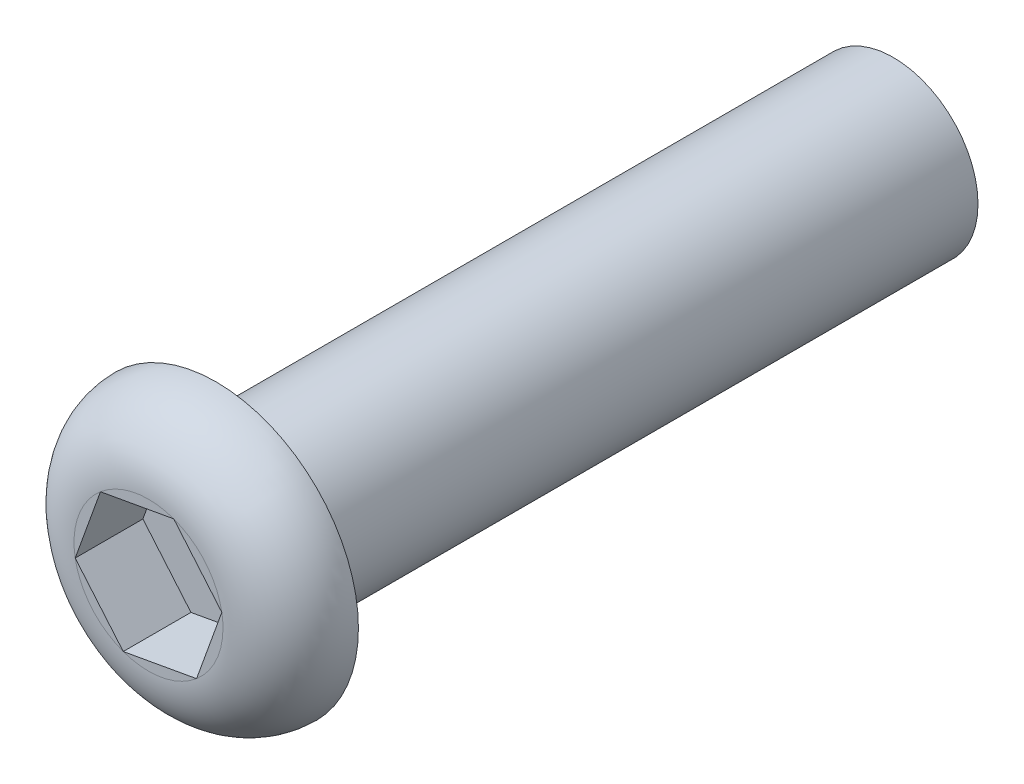
ISO-10303-21;
HEADER;
FILE_DESCRIPTION(('STEP AP214'),'2;1');
FILE_NAME('part.step','',(''),(''),'','','');
FILE_SCHEMA(('AUTOMOTIVE_DESIGN { 1 0 10303 214 1 1 1 1 }'));
ENDSEC;
DATA;
#1=APPLICATION_CONTEXT('core data for automotive mechanical design processes');
#2=APPLICATION_PROTOCOL_DEFINITION('international standard','automotive_design',2000,#1);
#3=PRODUCT_CONTEXT('',#1,'mechanical');
#4=PRODUCT('Part','Part','',(#3));
#5=PRODUCT_RELATED_PRODUCT_CATEGORY('part','',(#4));
#6=PRODUCT_DEFINITION_FORMATION('','',#4);
#7=PRODUCT_DEFINITION_CONTEXT('part definition',#1,'design');
#8=PRODUCT_DEFINITION('design','',#6,#7);
#9=PRODUCT_DEFINITION_SHAPE('','',#8);
#10=(LENGTH_UNIT() NAMED_UNIT(*) SI_UNIT(.MILLI.,.METRE.));
#11=(NAMED_UNIT(*) PLANE_ANGLE_UNIT() SI_UNIT($,.RADIAN.));
#12=(NAMED_UNIT(*) SI_UNIT($,.STERADIAN.) SOLID_ANGLE_UNIT());
#13=UNCERTAINTY_MEASURE_WITH_UNIT(LENGTH_MEASURE(1.E-05),#10,'distance_accuracy_value','');
#14=(GEOMETRIC_REPRESENTATION_CONTEXT(3) GLOBAL_UNCERTAINTY_ASSIGNED_CONTEXT((#13)) GLOBAL_UNIT_ASSIGNED_CONTEXT((#10,
#11,#12)) REPRESENTATION_CONTEXT('',''));
#15=CARTESIAN_POINT('',(0.,0.,0.));
#16=DIRECTION('',(0.,0.,1.));
#17=DIRECTION('',(1.,0.,0.));
#18=AXIS2_PLACEMENT_3D('',#15,#16,#17);
#19=CARTESIAN_POINT('',(0.,0.,27.94));
#20=DIRECTION('',(0.,0.,1.));
#21=DIRECTION('',(1.,0.,0.));
#22=AXIS2_PLACEMENT_3D('',#19,#20,#21);
#23=PLANE('',#22);
#24=DIRECTION('',(0.984262721187388,0.176711334330307,0.));
#25=VECTOR('',#24,1.);
#26=CARTESIAN_POINT('',(-0.947431027460046,-2.62846161246574,27.94));
#27=LINE('',#26,#25);
#28=CARTESIAN_POINT('',(-0.947431027460046,-2.62846161246574,27.94));
#29=VERTEX_POINT('',#28);
#30=CARTESIAN_POINT('',(1.80259901553751,-2.13473014434687,27.94));
#31=VERTEX_POINT('',#30);
#32=EDGE_CURVE('E59',#29,#31,#27,.T.);
#33=ORIENTED_EDGE('',*,*,#32,.F.);
#34=CARTESIAN_POINT('',(0.,0.,27.94));
#35=DIRECTION('',(0.,0.,1.));
#36=DIRECTION('',(1.,0.,0.));
#37=AXIS2_PLACEMENT_3D('',#34,#35,#36);
#38=CIRCLE('',#37,2.794);
#39=EDGE_CURVE('E215',#29,#31,#38,.T.);
#40=ORIENTED_EDGE('',*,*,#39,.T.);
#41=EDGE_LOOP('',(#33,#40));
#42=FACE_BOUND('',#41,.T.);
#43=ADVANCED_FACE('F43',(#42),#23,.T.);
#44=DIRECTION('',(0.645167865260385,-0.764040853381125,0.));
#45=VECTOR('',#44,1.);
#46=CARTESIAN_POINT('',(-2.75003004299756,-0.493731468118877,27.94));
#47=LINE('',#46,#45);
#48=CARTESIAN_POINT('',(-2.75003004299756,-0.493731468118877,27.94));
#49=VERTEX_POINT('',#48);
#50=EDGE_CURVE('E142',#49,#29,#47,.T.);
#51=ORIENTED_EDGE('',*,*,#50,.F.);
#52=EDGE_CURVE('E216',#49,#29,#38,.T.);
#53=ORIENTED_EDGE('',*,*,#52,.T.);
#54=EDGE_LOOP('',(#51,#53));
#55=FACE_BOUND('',#54,.T.);
#56=ADVANCED_FACE('F178',(#55),#23,.T.);
#57=DIRECTION('',(-0.339094855927003,-0.940752187711432,0.));
#58=VECTOR('',#57,1.);
#59=CARTESIAN_POINT('',(-1.80259901553751,2.13473014434686,27.94));
#60=LINE('',#59,#58);
#61=CARTESIAN_POINT('',(-1.80259901553751,2.13473014434686,27.94));
#62=VERTEX_POINT('',#61);
#63=EDGE_CURVE('E140',#62,#49,#60,.T.);
#64=ORIENTED_EDGE('',*,*,#63,.F.);
#65=EDGE_CURVE('E218',#62,#49,#38,.T.);
#66=ORIENTED_EDGE('',*,*,#65,.T.);
#67=EDGE_LOOP('',(#64,#66));
#68=FACE_BOUND('',#67,.T.);
#69=ADVANCED_FACE('F183',(#68),#23,.T.);
#70=DIRECTION('',(-0.984262721187388,-0.176711334330307,0.));
#71=VECTOR('',#70,1.);
#72=CARTESIAN_POINT('',(0.947431027460046,2.62846161246574,27.94));
#73=LINE('',#72,#71);
#74=CARTESIAN_POINT('',(0.947431027460046,2.62846161246574,27.94));
#75=VERTEX_POINT('',#74);
#76=EDGE_CURVE('E107',#75,#62,#73,.T.);
#77=ORIENTED_EDGE('',*,*,#76,.F.);
#78=EDGE_CURVE('E51',#75,#62,#38,.T.);
#79=ORIENTED_EDGE('',*,*,#78,.T.);
#80=EDGE_LOOP('',(#77,#79));
#81=FACE_BOUND('',#80,.T.);
#82=ADVANCED_FACE('F202',(#81),#23,.T.);
#83=DIRECTION('',(-0.645167865260385,0.764040853381125,0.));
#84=VECTOR('',#83,1.);
#85=CARTESIAN_POINT('',(2.75003004299756,0.493731468118877,27.94));
#86=LINE('',#85,#84);
#87=CARTESIAN_POINT('',(2.75003004299756,0.493731468118877,27.94));
#88=VERTEX_POINT('',#87);
#89=EDGE_CURVE('E136',#88,#75,#86,.T.);
#90=ORIENTED_EDGE('',*,*,#89,.F.);
#91=EDGE_CURVE('E11',#88,#75,#38,.T.);
#92=ORIENTED_EDGE('',*,*,#91,.T.);
#93=EDGE_LOOP('',(#90,#92));
#94=FACE_BOUND('',#93,.T.);
#95=ADVANCED_FACE('F174',(#94),#23,.T.);
#96=CARTESIAN_POINT('',(0.,0.,25.4));
#97=DIRECTION('',(0.,0.,1.));
#98=DIRECTION('',(1.,0.,0.));
#99=AXIS2_PLACEMENT_3D('',#96,#97,#98);
#100=TOROIDAL_SURFACE('',#99,2.794,2.54);
#101=ORIENTED_EDGE('',*,*,#91,.F.);
#102=EDGE_CURVE('E52',#31,#88,#38,.T.);
#103=ORIENTED_EDGE('',*,*,#102,.F.);
#104=ORIENTED_EDGE('',*,*,#39,.F.);
#105=ORIENTED_EDGE('',*,*,#52,.F.);
#106=ORIENTED_EDGE('',*,*,#65,.F.);
#107=ORIENTED_EDGE('',*,*,#78,.F.);
#108=EDGE_LOOP('',(#101,#103,#104,#105,#106,#107));
#109=FACE_BOUND('',#108,.T.);
#110=CARTESIAN_POINT('',(0.,0.,25.4));
#111=DIRECTION('',(0.,0.,1.));
#112=DIRECTION('',(1.,0.,0.));
#113=AXIS2_PLACEMENT_3D('',#110,#111,#112);
#114=CIRCLE('',#113,5.334);
#115=CARTESIAN_POINT('',(5.334,0.,25.4));
#116=VERTEX_POINT('',#115);
#117=EDGE_CURVE('E146',#116,#116,#114,.T.);
#118=ORIENTED_EDGE('',*,*,#117,.T.);
#119=EDGE_LOOP('',(#118));
#120=FACE_BOUND('',#119,.T.);
#121=ADVANCED_FACE('F45',(#109,#120),#100,.T.);
#122=CARTESIAN_POINT('',(0.,0.,25.4));
#123=DIRECTION('',(0.,0.,-1.));
#124=DIRECTION('',(-1.,0.,0.));
#125=AXIS2_PLACEMENT_3D('',#122,#123,#124);
#126=CYLINDRICAL_SURFACE('',#125,3.175);
#127=CARTESIAN_POINT('',(0.,0.,25.4));
#128=DIRECTION('',(0.,0.,1.));
#129=DIRECTION('',(1.,0.,0.));
#130=AXIS2_PLACEMENT_3D('',#127,#128,#129);
#131=CIRCLE('',#130,3.175);
#132=CARTESIAN_POINT('',(3.175,0.,25.4));
#133=VERTEX_POINT('',#132);
#134=EDGE_CURVE('E155',#133,#133,#131,.T.);
#135=ORIENTED_EDGE('',*,*,#134,.F.);
#136=EDGE_LOOP('',(#135));
#137=FACE_BOUND('',#136,.T.);
#138=CARTESIAN_POINT('',(0.,0.,0.));
#139=DIRECTION('',(0.,0.,1.));
#140=DIRECTION('',(1.,0.,0.));
#141=AXIS2_PLACEMENT_3D('',#138,#139,#140);
#142=CIRCLE('',#141,3.175);
#143=CARTESIAN_POINT('',(3.175,0.,0.));
#144=VERTEX_POINT('',#143);
#145=EDGE_CURVE('E154',#144,#144,#142,.T.);
#146=ORIENTED_EDGE('',*,*,#145,.T.);
#147=EDGE_LOOP('',(#146));
#148=FACE_BOUND('',#147,.T.);
#149=ADVANCED_FACE('F160',(#137,#148),#126,.T.);
#150=CARTESIAN_POINT('',(0.,0.,0.));
#151=DIRECTION('',(0.,0.,1.));
#152=DIRECTION('',(1.,0.,0.));
#153=AXIS2_PLACEMENT_3D('',#150,#151,#152);
#154=PLANE('',#153);
#155=ORIENTED_EDGE('',*,*,#145,.F.);
#156=EDGE_LOOP('',(#155));
#157=FACE_BOUND('',#156,.T.);
#158=ADVANCED_FACE('F162',(#157),#154,.F.);
#159=DIRECTION('',(0.339094855927003,0.940752187711432,0.));
#160=VECTOR('',#159,1.);
#161=CARTESIAN_POINT('',(1.80259901553751,-2.13473014434686,27.94));
#162=LINE('',#161,#160);
#163=EDGE_CURVE('E133',#31,#88,#162,.T.);
#164=ORIENTED_EDGE('',*,*,#163,.F.);
#165=ORIENTED_EDGE('',*,*,#102,.T.);
#166=EDGE_LOOP('',(#164,#165));
#167=FACE_BOUND('',#166,.T.);
#168=ADVANCED_FACE('F164',(#167),#23,.T.);
#169=CARTESIAN_POINT('',(0.,0.,25.4));
#170=DIRECTION('',(0.,0.,1.));
#171=DIRECTION('',(1.,0.,0.));
#172=AXIS2_PLACEMENT_3D('',#169,#170,#171);
#173=PLANE('',#172);
#174=ORIENTED_EDGE('',*,*,#134,.T.);
#175=EDGE_LOOP('',(#174));
#176=FACE_BOUND('',#175,.T.);
#177=ORIENTED_EDGE('',*,*,#117,.F.);
#178=EDGE_LOOP('',(#177));
#179=FACE_BOUND('',#178,.T.);
#180=ADVANCED_FACE('F171',(#176,#179),#173,.F.);
#181=CARTESIAN_POINT('',(-0.947431027460046,-2.62846161246574,25.4));
#182=DIRECTION('',(0.176711334330307,-0.984262721187388,0.));
#183=DIRECTION('',(0.984262721187389,0.176711334330307,0.));
#184=AXIS2_PLACEMENT_3D('',#181,#182,#183);
#185=PLANE('',#184);
#186=ORIENTED_EDGE('',*,*,#32,.T.);
#187=DIRECTION('',(0.,0.,1.));
#188=VECTOR('',#187,1.);
#189=CARTESIAN_POINT('',(1.80259901553751,-2.13473014434686,25.4));
#190=LINE('',#189,#188);
#191=CARTESIAN_POINT('',(1.80259901553751,-2.13473014434686,25.4));
#192=VERTEX_POINT('',#191);
#193=EDGE_CURVE('E89',#192,#31,#190,.T.);
#194=ORIENTED_EDGE('',*,*,#193,.F.);
#195=DIRECTION('',(0.984262721187388,0.176711334330307,0.));
#196=VECTOR('',#195,1.);
#197=CARTESIAN_POINT('',(-0.947431027460046,-2.62846161246574,25.4));
#198=LINE('',#197,#196);
#199=CARTESIAN_POINT('',(-0.947431027460046,-2.62846161246574,25.4));
#200=VERTEX_POINT('',#199);
#201=EDGE_CURVE('E144',#200,#192,#198,.T.);
#202=ORIENTED_EDGE('',*,*,#201,.F.);
#203=DIRECTION('',(0.,0.,1.));
#204=VECTOR('',#203,1.);
#205=CARTESIAN_POINT('',(-0.947431027460046,-2.62846161246574,25.4));
#206=LINE('',#205,#204);
#207=EDGE_CURVE('E67',#200,#29,#206,.T.);
#208=ORIENTED_EDGE('',*,*,#207,.T.);
#209=EDGE_LOOP('',(#186,#194,#202,#208));
#210=FACE_BOUND('',#209,.T.);
#211=ADVANCED_FACE('F186',(#210),#185,.F.);
#212=CARTESIAN_POINT('',(-2.75003004299756,-0.493731468118877,25.4));
#213=DIRECTION('',(-0.764040853381125,-0.645167865260385,0.));
#214=DIRECTION('',(0.645167865260385,-0.764040853381125,0.));
#215=AXIS2_PLACEMENT_3D('',#212,#213,#214);
#216=PLANE('',#215);
#217=ORIENTED_EDGE('',*,*,#50,.T.);
#218=ORIENTED_EDGE('',*,*,#207,.F.);
#219=DIRECTION('',(0.645167865260385,-0.764040853381125,0.));
#220=VECTOR('',#219,1.);
#221=CARTESIAN_POINT('',(-2.75003004299756,-0.493731468118877,25.4));
#222=LINE('',#221,#220);
#223=CARTESIAN_POINT('',(-2.75003004299756,-0.493731468118877,25.4));
#224=VERTEX_POINT('',#223);
#225=EDGE_CURVE('E119',#224,#200,#222,.T.);
#226=ORIENTED_EDGE('',*,*,#225,.F.);
#227=DIRECTION('',(0.,0.,1.));
#228=VECTOR('',#227,1.);
#229=CARTESIAN_POINT('',(-2.75003004299756,-0.493731468118877,25.4));
#230=LINE('',#229,#228);
#231=EDGE_CURVE('E111',#224,#49,#230,.T.);
#232=ORIENTED_EDGE('',*,*,#231,.T.);
#233=EDGE_LOOP('',(#217,#218,#226,#232));
#234=FACE_BOUND('',#233,.T.);
#235=ADVANCED_FACE('F192',(#234),#216,.F.);
#236=CARTESIAN_POINT('',(-1.80259901553751,2.13473014434686,25.4));
#237=DIRECTION('',(-0.940752187711432,0.339094855927003,0.));
#238=DIRECTION('',(-0.339094855927003,-0.940752187711432,0.));
#239=AXIS2_PLACEMENT_3D('',#236,#237,#238);
#240=PLANE('',#239);
#241=ORIENTED_EDGE('',*,*,#63,.T.);
#242=ORIENTED_EDGE('',*,*,#231,.F.);
#243=DIRECTION('',(-0.339094855927003,-0.940752187711432,0.));
#244=VECTOR('',#243,1.);
#245=CARTESIAN_POINT('',(-1.80259901553751,2.13473014434686,25.4));
#246=LINE('',#245,#244);
#247=CARTESIAN_POINT('',(-1.80259901553751,2.13473014434686,25.4));
#248=VERTEX_POINT('',#247);
#249=EDGE_CURVE('E115',#248,#224,#246,.T.);
#250=ORIENTED_EDGE('',*,*,#249,.F.);
#251=DIRECTION('',(0.,0.,1.));
#252=VECTOR('',#251,1.);
#253=CARTESIAN_POINT('',(-1.80259901553751,2.13473014434686,25.4));
#254=LINE('',#253,#252);
#255=EDGE_CURVE('E100',#248,#62,#254,.T.);
#256=ORIENTED_EDGE('',*,*,#255,.T.);
#257=EDGE_LOOP('',(#241,#242,#250,#256));
#258=FACE_BOUND('',#257,.T.);
#259=ADVANCED_FACE('F116',(#258),#240,.F.);
#260=CARTESIAN_POINT('',(0.947431027460046,2.62846161246574,25.4));
#261=DIRECTION('',(-0.176711334330307,0.984262721187388,0.));
#262=DIRECTION('',(-0.984262721187388,-0.176711334330307,0.));
#263=AXIS2_PLACEMENT_3D('',#260,#261,#262);
#264=PLANE('',#263);
#265=ORIENTED_EDGE('',*,*,#76,.T.);
#266=ORIENTED_EDGE('',*,*,#255,.F.);
#267=DIRECTION('',(-0.984262721187388,-0.176711334330307,0.));
#268=VECTOR('',#267,1.);
#269=CARTESIAN_POINT('',(0.947431027460046,2.62846161246574,25.4));
#270=LINE('',#269,#268);
#271=CARTESIAN_POINT('',(0.947431027460046,2.62846161246574,25.4));
#272=VERTEX_POINT('',#271);
#273=EDGE_CURVE('E104',#272,#248,#270,.T.);
#274=ORIENTED_EDGE('',*,*,#273,.F.);
#275=DIRECTION('',(0.,0.,1.));
#276=VECTOR('',#275,1.);
#277=CARTESIAN_POINT('',(0.947431027460046,2.62846161246574,25.4));
#278=LINE('',#277,#276);
#279=EDGE_CURVE('E112',#272,#75,#278,.T.);
#280=ORIENTED_EDGE('',*,*,#279,.T.);
#281=EDGE_LOOP('',(#265,#266,#274,#280));
#282=FACE_BOUND('',#281,.T.);
#283=ADVANCED_FACE('F102',(#282),#264,.F.);
#284=CARTESIAN_POINT('',(2.75003004299756,0.493731468118877,25.4));
#285=DIRECTION('',(0.764040853381125,0.645167865260385,0.));
#286=DIRECTION('',(-0.645167865260385,0.764040853381125,0.));
#287=AXIS2_PLACEMENT_3D('',#284,#285,#286);
#288=PLANE('',#287);
#289=ORIENTED_EDGE('',*,*,#89,.T.);
#290=ORIENTED_EDGE('',*,*,#279,.F.);
#291=DIRECTION('',(-0.645167865260385,0.764040853381125,0.));
#292=VECTOR('',#291,1.);
#293=CARTESIAN_POINT('',(2.75003004299756,0.493731468118877,25.4));
#294=LINE('',#293,#292);
#295=CARTESIAN_POINT('',(2.75003004299756,0.493731468118877,25.4));
#296=VERTEX_POINT('',#295);
#297=EDGE_CURVE('E125',#296,#272,#294,.T.);
#298=ORIENTED_EDGE('',*,*,#297,.F.);
#299=DIRECTION('',(0.,0.,1.));
#300=VECTOR('',#299,1.);
#301=CARTESIAN_POINT('',(2.75003004299756,0.493731468118877,25.4));
#302=LINE('',#301,#300);
#303=EDGE_CURVE('E149',#296,#88,#302,.T.);
#304=ORIENTED_EDGE('',*,*,#303,.T.);
#305=EDGE_LOOP('',(#289,#290,#298,#304));
#306=FACE_BOUND('',#305,.T.);
#307=ADVANCED_FACE('F233',(#306),#288,.F.);
#308=CARTESIAN_POINT('',(1.80259901553751,-2.13473014434686,25.4));
#309=DIRECTION('',(0.940752187711432,-0.339094855927003,0.));
#310=DIRECTION('',(0.339094855927003,0.940752187711432,0.));
#311=AXIS2_PLACEMENT_3D('',#308,#309,#310);
#312=PLANE('',#311);
#313=ORIENTED_EDGE('',*,*,#163,.T.);
#314=ORIENTED_EDGE('',*,*,#303,.F.);
#315=DIRECTION('',(0.339094855927003,0.940752187711432,0.));
#316=VECTOR('',#315,1.);
#317=CARTESIAN_POINT('',(1.80259901553751,-2.13473014434686,25.4));
#318=LINE('',#317,#316);
#319=EDGE_CURVE('E127',#192,#296,#318,.T.);
#320=ORIENTED_EDGE('',*,*,#319,.F.);
#321=ORIENTED_EDGE('',*,*,#193,.T.);
#322=EDGE_LOOP('',(#313,#314,#320,#321));
#323=FACE_BOUND('',#322,.T.);
#324=ADVANCED_FACE('F232',(#323),#312,.F.);
#325=CARTESIAN_POINT('',(0.,0.,25.4));
#326=DIRECTION('',(0.,0.,1.));
#327=DIRECTION('',(1.,0.,0.));
#328=AXIS2_PLACEMENT_3D('',#325,#326,#327);
#329=PLANE('',#328);
#330=ORIENTED_EDGE('',*,*,#201,.T.);
#331=ORIENTED_EDGE('',*,*,#319,.T.);
#332=ORIENTED_EDGE('',*,*,#297,.T.);
#333=ORIENTED_EDGE('',*,*,#273,.T.);
#334=ORIENTED_EDGE('',*,*,#249,.T.);
#335=ORIENTED_EDGE('',*,*,#225,.T.);
#336=EDGE_LOOP('',(#330,#331,#332,#333,#334,#335));
#337=FACE_BOUND('',#336,.T.);
#338=ADVANCED_FACE('F122',(#337),#329,.T.);
#339=CLOSED_SHELL('',(#43,#56,#69,#82,#95,#121,#149,#158,#168,#180,#211,#235,#259,#283,#307,
#324,#338));
#340=MANIFOLD_SOLID_BREP('B2',#339);
#341=ADVANCED_BREP_SHAPE_REPRESENTATION('',(#18,#340),#14);
#342=SHAPE_DEFINITION_REPRESENTATION(#9,#341);
ENDSEC;
END-ISO-10303-21;
